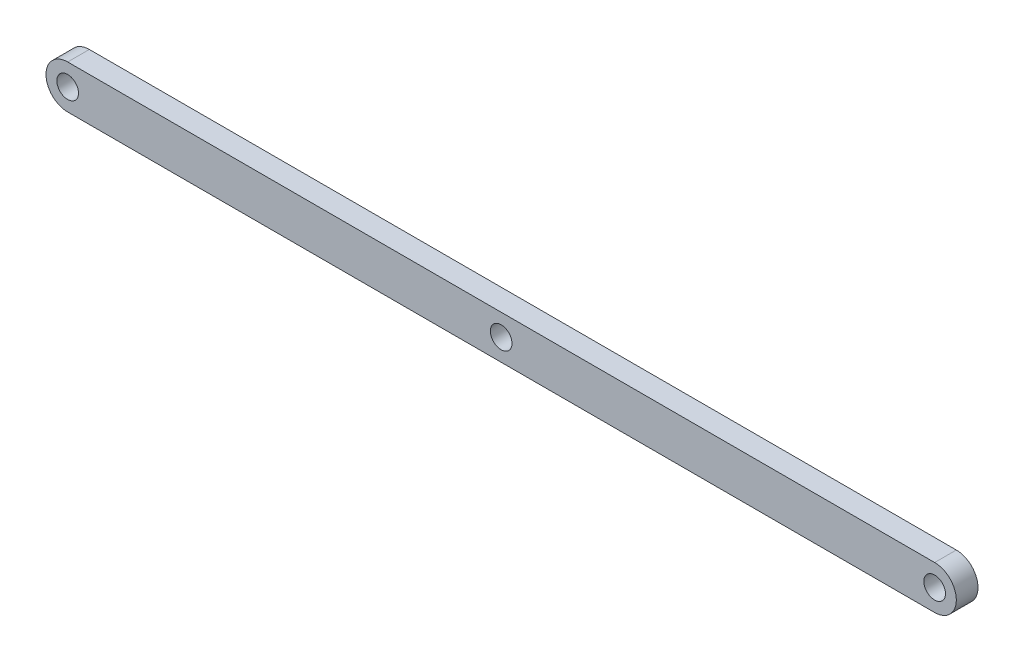
ISO-10303-21;
HEADER;
FILE_DESCRIPTION(('STEP AP214'),'2;1');
FILE_NAME('part.step','',(''),(''),'','','');
FILE_SCHEMA(('AUTOMOTIVE_DESIGN { 1 0 10303 214 1 1 1 1 }'));
ENDSEC;
DATA;
#1=APPLICATION_CONTEXT('core data for automotive mechanical design processes');
#2=APPLICATION_PROTOCOL_DEFINITION('international standard','automotive_design',2000,#1);
#3=PRODUCT_CONTEXT('',#1,'mechanical');
#4=PRODUCT('Part','Part','',(#3));
#5=PRODUCT_RELATED_PRODUCT_CATEGORY('part','',(#4));
#6=PRODUCT_DEFINITION_FORMATION('','',#4);
#7=PRODUCT_DEFINITION_CONTEXT('part definition',#1,'design');
#8=PRODUCT_DEFINITION('design','',#6,#7);
#9=PRODUCT_DEFINITION_SHAPE('','',#8);
#10=(LENGTH_UNIT() NAMED_UNIT(*) SI_UNIT(.MILLI.,.METRE.));
#11=(NAMED_UNIT(*) PLANE_ANGLE_UNIT() SI_UNIT($,.RADIAN.));
#12=(NAMED_UNIT(*) SI_UNIT($,.STERADIAN.) SOLID_ANGLE_UNIT());
#13=UNCERTAINTY_MEASURE_WITH_UNIT(LENGTH_MEASURE(1.E-05),#10,'distance_accuracy_value','');
#14=(GEOMETRIC_REPRESENTATION_CONTEXT(3) GLOBAL_UNCERTAINTY_ASSIGNED_CONTEXT((#13)) GLOBAL_UNIT_ASSIGNED_CONTEXT((#10,
#11,#12)) REPRESENTATION_CONTEXT('',''));
#15=CARTESIAN_POINT('',(0.,0.,0.));
#16=DIRECTION('',(0.,0.,1.));
#17=DIRECTION('',(1.,0.,0.));
#18=AXIS2_PLACEMENT_3D('',#15,#16,#17);
#19=CARTESIAN_POINT('',(0.,0.,5.));
#20=DIRECTION('',(0.,0.,1.));
#21=DIRECTION('',(1.,0.,0.));
#22=AXIS2_PLACEMENT_3D('',#19,#20,#21);
#23=PLANE('',#22);
#24=CARTESIAN_POINT('',(100.,0.,5.));
#25=DIRECTION('',(0.,0.,1.));
#26=DIRECTION('',(1.,0.,0.));
#27=AXIS2_PLACEMENT_3D('',#24,#25,#26);
#28=CIRCLE('',#27,2.49999999999999);
#29=CARTESIAN_POINT('',(102.5,0.,5.));
#30=VERTEX_POINT('',#29);
#31=EDGE_CURVE('E129',#30,#30,#28,.T.);
#32=ORIENTED_EDGE('',*,*,#31,.F.);
#33=EDGE_LOOP('',(#32));
#34=FACE_BOUND('',#33,.T.);
#35=CARTESIAN_POINT('',(200.,0.,5.));
#36=DIRECTION('',(0.,0.,1.));
#37=DIRECTION('',(1.,0.,0.));
#38=AXIS2_PLACEMENT_3D('',#35,#36,#37);
#39=CIRCLE('',#38,2.5);
#40=CARTESIAN_POINT('',(202.5,0.,5.));
#41=VERTEX_POINT('',#40);
#42=EDGE_CURVE('E106',#41,#41,#39,.T.);
#43=ORIENTED_EDGE('',*,*,#42,.F.);
#44=EDGE_LOOP('',(#43));
#45=FACE_BOUND('',#44,.T.);
#46=CARTESIAN_POINT('',(0.,0.,5.));
#47=DIRECTION('',(0.,0.,1.));
#48=DIRECTION('',(1.,0.,0.));
#49=AXIS2_PLACEMENT_3D('',#46,#47,#48);
#50=CIRCLE('',#49,5.);
#51=CARTESIAN_POINT('',(0.,5.,5.));
#52=VERTEX_POINT('',#51);
#53=CARTESIAN_POINT('',(0.,-5.,5.));
#54=VERTEX_POINT('',#53);
#55=EDGE_CURVE('E90',#52,#54,#50,.T.);
#56=ORIENTED_EDGE('',*,*,#55,.T.);
#57=DIRECTION('',(1.,0.,0.));
#58=VECTOR('',#57,1.);
#59=CARTESIAN_POINT('',(0.,-5.,5.));
#60=LINE('',#59,#58);
#61=CARTESIAN_POINT('',(200.,-5.,5.));
#62=VERTEX_POINT('',#61);
#63=EDGE_CURVE('E85',#54,#62,#60,.T.);
#64=ORIENTED_EDGE('',*,*,#63,.T.);
#65=CARTESIAN_POINT('',(200.,0.,5.));
#66=DIRECTION('',(0.,0.,1.));
#67=DIRECTION('',(1.,0.,0.));
#68=AXIS2_PLACEMENT_3D('',#65,#66,#67);
#69=CIRCLE('',#68,5.);
#70=CARTESIAN_POINT('',(200.,5.,5.));
#71=VERTEX_POINT('',#70);
#72=EDGE_CURVE('E88',#62,#71,#69,.T.);
#73=ORIENTED_EDGE('',*,*,#72,.T.);
#74=DIRECTION('',(-1.,0.,0.));
#75=VECTOR('',#74,1.);
#76=CARTESIAN_POINT('',(0.,5.,5.));
#77=LINE('',#76,#75);
#78=EDGE_CURVE('E55',#71,#52,#77,.T.);
#79=ORIENTED_EDGE('',*,*,#78,.T.);
#80=EDGE_LOOP('',(#56,#64,#73,#79));
#81=FACE_BOUND('',#80,.T.);
#82=CARTESIAN_POINT('',(0.,0.,5.));
#83=DIRECTION('',(0.,0.,1.));
#84=DIRECTION('',(1.,0.,0.));
#85=AXIS2_PLACEMENT_3D('',#82,#83,#84);
#86=CIRCLE('',#85,2.5);
#87=CARTESIAN_POINT('',(2.5,0.,5.));
#88=VERTEX_POINT('',#87);
#89=EDGE_CURVE('E121',#88,#88,#86,.T.);
#90=ORIENTED_EDGE('',*,*,#89,.F.);
#91=EDGE_LOOP('',(#90));
#92=FACE_BOUND('',#91,.T.);
#93=ADVANCED_FACE('F37',(#34,#45,#81,#92),#23,.T.);
#94=CARTESIAN_POINT('',(0.,0.,0.));
#95=DIRECTION('',(0.,0.,1.));
#96=DIRECTION('',(1.,0.,0.));
#97=AXIS2_PLACEMENT_3D('',#94,#95,#96);
#98=PLANE('',#97);
#99=CARTESIAN_POINT('',(100.,0.,0.));
#100=DIRECTION('',(0.,0.,1.));
#101=DIRECTION('',(1.,0.,0.));
#102=AXIS2_PLACEMENT_3D('',#99,#100,#101);
#103=CIRCLE('',#102,2.49999999999999);
#104=CARTESIAN_POINT('',(102.5,0.,0.));
#105=VERTEX_POINT('',#104);
#106=EDGE_CURVE('E41',#105,#105,#103,.T.);
#107=ORIENTED_EDGE('',*,*,#106,.T.);
#108=EDGE_LOOP('',(#107));
#109=FACE_BOUND('',#108,.T.);
#110=CARTESIAN_POINT('',(0.,0.,0.));
#111=DIRECTION('',(0.,0.,1.));
#112=DIRECTION('',(1.,0.,0.));
#113=AXIS2_PLACEMENT_3D('',#110,#111,#112);
#114=CIRCLE('',#113,5.);
#115=CARTESIAN_POINT('',(0.,5.,0.));
#116=VERTEX_POINT('',#115);
#117=CARTESIAN_POINT('',(0.,-5.,0.));
#118=VERTEX_POINT('',#117);
#119=EDGE_CURVE('E103',#116,#118,#114,.T.);
#120=ORIENTED_EDGE('',*,*,#119,.F.);
#121=DIRECTION('',(-1.,0.,0.));
#122=VECTOR('',#121,1.);
#123=CARTESIAN_POINT('',(0.,5.,0.));
#124=LINE('',#123,#122);
#125=CARTESIAN_POINT('',(200.,5.,0.));
#126=VERTEX_POINT('',#125);
#127=EDGE_CURVE('E78',#126,#116,#124,.T.);
#128=ORIENTED_EDGE('',*,*,#127,.F.);
#129=CARTESIAN_POINT('',(200.,0.,0.));
#130=DIRECTION('',(0.,0.,1.));
#131=DIRECTION('',(1.,0.,0.));
#132=AXIS2_PLACEMENT_3D('',#129,#130,#131);
#133=CIRCLE('',#132,5.);
#134=CARTESIAN_POINT('',(200.,-5.,0.));
#135=VERTEX_POINT('',#134);
#136=EDGE_CURVE('E72',#135,#126,#133,.T.);
#137=ORIENTED_EDGE('',*,*,#136,.F.);
#138=DIRECTION('',(1.,0.,0.));
#139=VECTOR('',#138,1.);
#140=CARTESIAN_POINT('',(0.,-5.,0.));
#141=LINE('',#140,#139);
#142=EDGE_CURVE('E94',#118,#135,#141,.T.);
#143=ORIENTED_EDGE('',*,*,#142,.F.);
#144=EDGE_LOOP('',(#120,#128,#137,#143));
#145=FACE_BOUND('',#144,.T.);
#146=CARTESIAN_POINT('',(200.,0.,0.));
#147=DIRECTION('',(0.,0.,1.));
#148=DIRECTION('',(1.,0.,0.));
#149=AXIS2_PLACEMENT_3D('',#146,#147,#148);
#150=CIRCLE('',#149,2.5);
#151=CARTESIAN_POINT('',(202.5,0.,0.));
#152=VERTEX_POINT('',#151);
#153=EDGE_CURVE('E118',#152,#152,#150,.T.);
#154=ORIENTED_EDGE('',*,*,#153,.T.);
#155=EDGE_LOOP('',(#154));
#156=FACE_BOUND('',#155,.T.);
#157=CARTESIAN_POINT('',(0.,0.,0.));
#158=DIRECTION('',(0.,0.,1.));
#159=DIRECTION('',(1.,0.,0.));
#160=AXIS2_PLACEMENT_3D('',#157,#158,#159);
#161=CIRCLE('',#160,2.5);
#162=CARTESIAN_POINT('',(2.5,0.,0.));
#163=VERTEX_POINT('',#162);
#164=EDGE_CURVE('E124',#163,#163,#161,.T.);
#165=ORIENTED_EDGE('',*,*,#164,.T.);
#166=EDGE_LOOP('',(#165));
#167=FACE_BOUND('',#166,.T.);
#168=ADVANCED_FACE('F114',(#109,#145,#156,#167),#98,.F.);
#169=CARTESIAN_POINT('',(0.,0.,5.));
#170=DIRECTION('',(0.,0.,-1.));
#171=DIRECTION('',(-1.,0.,0.));
#172=AXIS2_PLACEMENT_3D('',#169,#170,#171);
#173=CYLINDRICAL_SURFACE('',#172,5.);
#174=ORIENTED_EDGE('',*,*,#119,.T.);
#175=DIRECTION('',(0.,0.,-1.));
#176=VECTOR('',#175,1.);
#177=CARTESIAN_POINT('',(0.,-5.,5.));
#178=LINE('',#177,#176);
#179=EDGE_CURVE('E11',#54,#118,#178,.T.);
#180=ORIENTED_EDGE('',*,*,#179,.F.);
#181=ORIENTED_EDGE('',*,*,#55,.F.);
#182=DIRECTION('',(0.,0.,-1.));
#183=VECTOR('',#182,1.);
#184=CARTESIAN_POINT('',(0.,5.,5.));
#185=LINE('',#184,#183);
#186=EDGE_CURVE('E99',#52,#116,#185,.T.);
#187=ORIENTED_EDGE('',*,*,#186,.T.);
#188=EDGE_LOOP('',(#174,#180,#181,#187));
#189=FACE_BOUND('',#188,.T.);
#190=ADVANCED_FACE('F39',(#189),#173,.T.);
#191=CARTESIAN_POINT('',(0.,-5.,5.));
#192=DIRECTION('',(0.,1.,0.));
#193=DIRECTION('',(0.,0.,1.));
#194=AXIS2_PLACEMENT_3D('',#191,#192,#193);
#195=PLANE('',#194);
#196=ORIENTED_EDGE('',*,*,#142,.T.);
#197=DIRECTION('',(0.,0.,-1.));
#198=VECTOR('',#197,1.);
#199=CARTESIAN_POINT('',(200.,-5.,5.));
#200=LINE('',#199,#198);
#201=EDGE_CURVE('E47',#62,#135,#200,.T.);
#202=ORIENTED_EDGE('',*,*,#201,.F.);
#203=ORIENTED_EDGE('',*,*,#63,.F.);
#204=ORIENTED_EDGE('',*,*,#179,.T.);
#205=EDGE_LOOP('',(#196,#202,#203,#204));
#206=FACE_BOUND('',#205,.T.);
#207=ADVANCED_FACE('F93',(#206),#195,.F.);
#208=CARTESIAN_POINT('',(200.,0.,5.));
#209=DIRECTION('',(0.,0.,-1.));
#210=DIRECTION('',(-1.,0.,0.));
#211=AXIS2_PLACEMENT_3D('',#208,#209,#210);
#212=CYLINDRICAL_SURFACE('',#211,5.);
#213=ORIENTED_EDGE('',*,*,#136,.T.);
#214=DIRECTION('',(0.,0.,-1.));
#215=VECTOR('',#214,1.);
#216=CARTESIAN_POINT('',(200.,5.,5.));
#217=LINE('',#216,#215);
#218=EDGE_CURVE('E95',#71,#126,#217,.T.);
#219=ORIENTED_EDGE('',*,*,#218,.F.);
#220=ORIENTED_EDGE('',*,*,#72,.F.);
#221=ORIENTED_EDGE('',*,*,#201,.T.);
#222=EDGE_LOOP('',(#213,#219,#220,#221));
#223=FACE_BOUND('',#222,.T.);
#224=ADVANCED_FACE('F97',(#223),#212,.T.);
#225=CARTESIAN_POINT('',(0.,5.,5.));
#226=DIRECTION('',(0.,-1.,0.));
#227=DIRECTION('',(0.,0.,-1.));
#228=AXIS2_PLACEMENT_3D('',#225,#226,#227);
#229=PLANE('',#228);
#230=ORIENTED_EDGE('',*,*,#127,.T.);
#231=ORIENTED_EDGE('',*,*,#186,.F.);
#232=ORIENTED_EDGE('',*,*,#78,.F.);
#233=ORIENTED_EDGE('',*,*,#218,.T.);
#234=EDGE_LOOP('',(#230,#231,#232,#233));
#235=FACE_BOUND('',#234,.T.);
#236=ADVANCED_FACE('F111',(#235),#229,.F.);
#237=CARTESIAN_POINT('',(200.,0.,5.));
#238=DIRECTION('',(0.,0.,-1.));
#239=DIRECTION('',(-1.,0.,0.));
#240=AXIS2_PLACEMENT_3D('',#237,#238,#239);
#241=CYLINDRICAL_SURFACE('',#240,2.5);
#242=ORIENTED_EDGE('',*,*,#42,.T.);
#243=EDGE_LOOP('',(#242));
#244=FACE_BOUND('',#243,.T.);
#245=ORIENTED_EDGE('',*,*,#153,.F.);
#246=EDGE_LOOP('',(#245));
#247=FACE_BOUND('',#246,.T.);
#248=ADVANCED_FACE('F144',(#244,#247),#241,.F.);
#249=CARTESIAN_POINT('',(0.,0.,5.));
#250=DIRECTION('',(0.,0.,-1.));
#251=DIRECTION('',(-1.,0.,0.));
#252=AXIS2_PLACEMENT_3D('',#249,#250,#251);
#253=CYLINDRICAL_SURFACE('',#252,2.5);
#254=ORIENTED_EDGE('',*,*,#89,.T.);
#255=EDGE_LOOP('',(#254));
#256=FACE_BOUND('',#255,.T.);
#257=ORIENTED_EDGE('',*,*,#164,.F.);
#258=EDGE_LOOP('',(#257));
#259=FACE_BOUND('',#258,.T.);
#260=ADVANCED_FACE('F139',(#256,#259),#253,.F.);
#261=CARTESIAN_POINT('',(100.,0.,-5.));
#262=DIRECTION('',(0.,0.,1.));
#263=DIRECTION('',(1.,0.,0.));
#264=AXIS2_PLACEMENT_3D('',#261,#262,#263);
#265=CYLINDRICAL_SURFACE('',#264,2.49999999999999);
#266=ORIENTED_EDGE('',*,*,#31,.T.);
#267=EDGE_LOOP('',(#266));
#268=FACE_BOUND('',#267,.T.);
#269=ORIENTED_EDGE('',*,*,#106,.F.);
#270=EDGE_LOOP('',(#269));
#271=FACE_BOUND('',#270,.T.);
#272=ADVANCED_FACE('F137',(#268,#271),#265,.F.);
#273=CLOSED_SHELL('',(#93,#168,#190,#207,#224,#236,#248,#260,#272));
#274=MANIFOLD_SOLID_BREP('B2',#273);
#275=ADVANCED_BREP_SHAPE_REPRESENTATION('',(#18,#274),#14);
#276=SHAPE_DEFINITION_REPRESENTATION(#9,#275);
ENDSEC;
END-ISO-10303-21;
